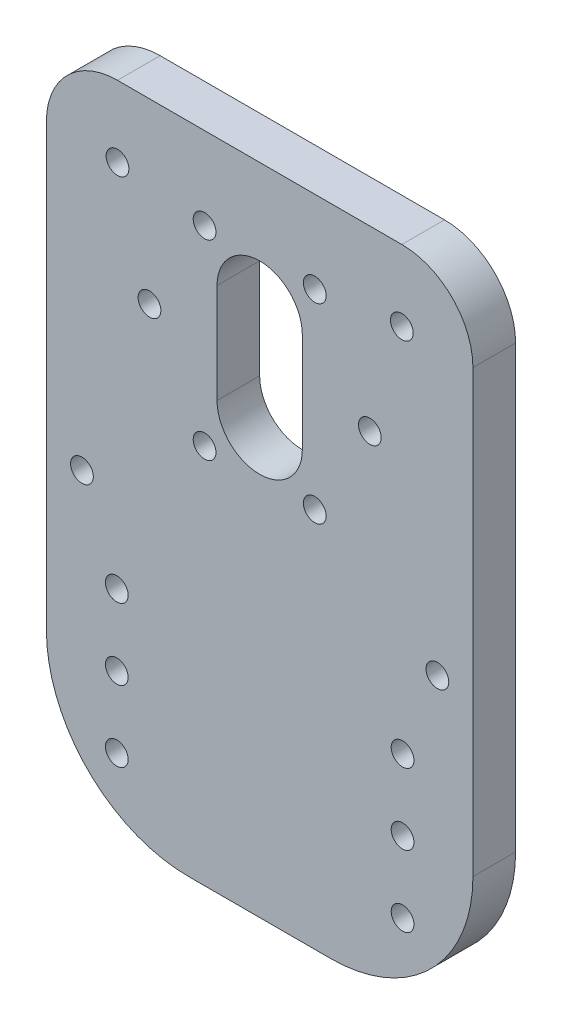
ISO-10303-21;
HEADER;
FILE_DESCRIPTION(('STEP AP214'),'2;1');
FILE_NAME('part.step','',(''),(''),'','','');
FILE_SCHEMA(('AUTOMOTIVE_DESIGN { 1 0 10303 214 1 1 1 1 }'));
ENDSEC;
DATA;
#1=APPLICATION_CONTEXT('core data for automotive mechanical design processes');
#2=APPLICATION_PROTOCOL_DEFINITION('international standard','automotive_design',2000,#1);
#3=PRODUCT_CONTEXT('',#1,'mechanical');
#4=PRODUCT('Part','Part','',(#3));
#5=PRODUCT_RELATED_PRODUCT_CATEGORY('part','',(#4));
#6=PRODUCT_DEFINITION_FORMATION('','',#4);
#7=PRODUCT_DEFINITION_CONTEXT('part definition',#1,'design');
#8=PRODUCT_DEFINITION('design','',#6,#7);
#9=PRODUCT_DEFINITION_SHAPE('','',#8);
#10=(LENGTH_UNIT() NAMED_UNIT(*) SI_UNIT(.MILLI.,.METRE.));
#11=(NAMED_UNIT(*) PLANE_ANGLE_UNIT() SI_UNIT($,.RADIAN.));
#12=(NAMED_UNIT(*) SI_UNIT($,.STERADIAN.) SOLID_ANGLE_UNIT());
#13=UNCERTAINTY_MEASURE_WITH_UNIT(LENGTH_MEASURE(1.E-05),#10,'distance_accuracy_value','');
#14=(GEOMETRIC_REPRESENTATION_CONTEXT(3) GLOBAL_UNCERTAINTY_ASSIGNED_CONTEXT((#13)) GLOBAL_UNIT_ASSIGNED_CONTEXT((#10,
#11,#12)) REPRESENTATION_CONTEXT('',''));
#15=CARTESIAN_POINT('',(0.,0.,0.));
#16=DIRECTION('',(0.,0.,1.));
#17=DIRECTION('',(1.,0.,0.));
#18=AXIS2_PLACEMENT_3D('',#15,#16,#17);
#19=CARTESIAN_POINT('',(0.,0.,6.));
#20=DIRECTION('',(0.,0.,1.));
#21=DIRECTION('',(1.,0.,0.));
#22=AXIS2_PLACEMENT_3D('',#19,#20,#21);
#23=PLANE('',#22);
#24=CARTESIAN_POINT('',(-15.5,35.,6.));
#25=DIRECTION('',(0.,0.,1.));
#26=DIRECTION('',(1.,0.,0.));
#27=AXIS2_PLACEMENT_3D('',#24,#25,#26);
#28=CIRCLE('',#27,1.6);
#29=CARTESIAN_POINT('',(-13.9,35.,6.));
#30=VERTEX_POINT('',#29);
#31=EDGE_CURVE('E267',#30,#30,#28,.T.);
#32=ORIENTED_EDGE('',*,*,#31,.F.);
#33=EDGE_LOOP('',(#32));
#34=FACE_BOUND('',#33,.T.);
#35=CARTESIAN_POINT('',(-7.75000000000016,21.5766062413413,6.));
#36=DIRECTION('',(0.,0.,1.));
#37=DIRECTION('',(1.,0.,0.));
#38=AXIS2_PLACEMENT_3D('',#35,#36,#37);
#39=CIRCLE('',#38,1.6);
#40=CARTESIAN_POINT('',(-6.15000000000016,21.5766062413413,6.));
#41=VERTEX_POINT('',#40);
#42=EDGE_CURVE('E756',#41,#41,#39,.T.);
#43=ORIENTED_EDGE('',*,*,#42,.F.);
#44=EDGE_LOOP('',(#43));
#45=FACE_BOUND('',#44,.T.);
#46=CARTESIAN_POINT('',(7.74999999999988,21.5766062413412,6.));
#47=DIRECTION('',(0.,0.,1.));
#48=DIRECTION('',(1.,0.,0.));
#49=AXIS2_PLACEMENT_3D('',#46,#47,#48);
#50=CIRCLE('',#49,1.6);
#51=CARTESIAN_POINT('',(9.34999999999988,21.5766062413412,6.));
#52=VERTEX_POINT('',#51);
#53=EDGE_CURVE('E759',#52,#52,#50,.T.);
#54=ORIENTED_EDGE('',*,*,#53,.F.);
#55=EDGE_LOOP('',(#54));
#56=FACE_BOUND('',#55,.T.);
#57=CARTESIAN_POINT('',(15.5,34.9999999999999,6.));
#58=DIRECTION('',(0.,0.,1.));
#59=DIRECTION('',(1.,0.,0.));
#60=AXIS2_PLACEMENT_3D('',#57,#58,#59);
#61=CIRCLE('',#60,1.6);
#62=CARTESIAN_POINT('',(17.1,34.9999999999999,6.));
#63=VERTEX_POINT('',#62);
#64=EDGE_CURVE('E764',#63,#63,#61,.T.);
#65=ORIENTED_EDGE('',*,*,#64,.F.);
#66=EDGE_LOOP('',(#65));
#67=FACE_BOUND('',#66,.T.);
#68=CARTESIAN_POINT('',(7.75000000000007,48.4233937586588,6.));
#69=DIRECTION('',(0.,0.,1.));
#70=DIRECTION('',(1.,0.,0.));
#71=AXIS2_PLACEMENT_3D('',#68,#69,#70);
#72=CIRCLE('',#71,1.6);
#73=CARTESIAN_POINT('',(9.35000000000007,48.4233937586588,6.));
#74=VERTEX_POINT('',#73);
#75=EDGE_CURVE('E753',#74,#74,#72,.T.);
#76=ORIENTED_EDGE('',*,*,#75,.F.);
#77=EDGE_LOOP('',(#76));
#78=FACE_BOUND('',#77,.T.);
#79=CARTESIAN_POINT('',(-7.74999999999998,48.4233937586589,6.));
#80=DIRECTION('',(0.,0.,1.));
#81=DIRECTION('',(1.,0.,0.));
#82=AXIS2_PLACEMENT_3D('',#79,#80,#81);
#83=CIRCLE('',#82,1.6);
#84=CARTESIAN_POINT('',(-6.14999999999998,48.4233937586589,6.));
#85=VERTEX_POINT('',#84);
#86=EDGE_CURVE('E749',#85,#85,#83,.T.);
#87=ORIENTED_EDGE('',*,*,#86,.F.);
#88=EDGE_LOOP('',(#87));
#89=FACE_BOUND('',#88,.T.);
#90=CARTESIAN_POINT('',(24.9999999999999,9.99999999999976,6.));
#91=DIRECTION('',(0.,0.,1.));
#92=DIRECTION('',(1.,0.,0.));
#93=AXIS2_PLACEMENT_3D('',#90,#91,#92);
#94=CIRCLE('',#93,1.6);
#95=CARTESIAN_POINT('',(26.5999999999999,9.99999999999976,6.));
#96=VERTEX_POINT('',#95);
#97=EDGE_CURVE('E316',#96,#96,#94,.T.);
#98=ORIENTED_EDGE('',*,*,#97,.F.);
#99=EDGE_LOOP('',(#98));
#100=FACE_BOUND('',#99,.T.);
#101=CARTESIAN_POINT('',(-25.0000000000001,10.0000000000001,6.));
#102=DIRECTION('',(0.,0.,1.));
#103=DIRECTION('',(1.,0.,0.));
#104=AXIS2_PLACEMENT_3D('',#101,#102,#103);
#105=CIRCLE('',#104,1.6);
#106=CARTESIAN_POINT('',(-23.4000000000001,10.0000000000001,6.));
#107=VERTEX_POINT('',#106);
#108=EDGE_CURVE('E312',#107,#107,#105,.T.);
#109=ORIENTED_EDGE('',*,*,#108,.F.);
#110=EDGE_LOOP('',(#109));
#111=FACE_BOUND('',#110,.T.);
#112=CARTESIAN_POINT('',(-20.,50.0000000000003,6.));
#113=DIRECTION('',(0.,0.,1.));
#114=DIRECTION('',(1.,0.,0.));
#115=AXIS2_PLACEMENT_3D('',#112,#113,#114);
#116=CIRCLE('',#115,1.6);
#117=CARTESIAN_POINT('',(-18.4,50.0000000000003,6.));
#118=VERTEX_POINT('',#117);
#119=EDGE_CURVE('E308',#118,#118,#116,.T.);
#120=ORIENTED_EDGE('',*,*,#119,.F.);
#121=EDGE_LOOP('',(#120));
#122=FACE_BOUND('',#121,.T.);
#123=CARTESIAN_POINT('',(20.,50.,6.));
#124=DIRECTION('',(0.,0.,1.));
#125=DIRECTION('',(1.,0.,0.));
#126=AXIS2_PLACEMENT_3D('',#123,#124,#125);
#127=CIRCLE('',#126,1.6);
#128=CARTESIAN_POINT('',(21.6,50.,6.));
#129=VERTEX_POINT('',#128);
#130=EDGE_CURVE('E304',#129,#129,#127,.T.);
#131=ORIENTED_EDGE('',*,*,#130,.F.);
#132=EDGE_LOOP('',(#131));
#133=FACE_BOUND('',#132,.T.);
#134=CARTESIAN_POINT('',(-20.0999999999999,-22.,6.));
#135=DIRECTION('',(0.,0.,1.));
#136=DIRECTION('',(1.,0.,0.));
#137=AXIS2_PLACEMENT_3D('',#134,#135,#136);
#138=CIRCLE('',#137,1.6);
#139=CARTESIAN_POINT('',(-18.4999999999999,-22.,6.));
#140=VERTEX_POINT('',#139);
#141=EDGE_CURVE('E362',#140,#140,#138,.T.);
#142=ORIENTED_EDGE('',*,*,#141,.F.);
#143=EDGE_LOOP('',(#142));
#144=FACE_BOUND('',#143,.T.);
#145=CARTESIAN_POINT('',(-20.1,-12.,6.));
#146=DIRECTION('',(0.,0.,1.));
#147=DIRECTION('',(1.,0.,0.));
#148=AXIS2_PLACEMENT_3D('',#145,#146,#147);
#149=CIRCLE('',#148,1.6);
#150=CARTESIAN_POINT('',(-18.5,-12.,6.));
#151=VERTEX_POINT('',#150);
#152=EDGE_CURVE('E354',#151,#151,#149,.T.);
#153=ORIENTED_EDGE('',*,*,#152,.F.);
#154=EDGE_LOOP('',(#153));
#155=FACE_BOUND('',#154,.T.);
#156=CARTESIAN_POINT('',(-20.1,-1.99999999999997,6.));
#157=DIRECTION('',(0.,0.,1.));
#158=DIRECTION('',(1.,0.,0.));
#159=AXIS2_PLACEMENT_3D('',#156,#157,#158);
#160=CIRCLE('',#159,1.6);
#161=CARTESIAN_POINT('',(-18.5,-1.99999999999997,6.));
#162=VERTEX_POINT('',#161);
#163=EDGE_CURVE('E346',#162,#162,#160,.T.);
#164=ORIENTED_EDGE('',*,*,#163,.F.);
#165=EDGE_LOOP('',(#164));
#166=FACE_BOUND('',#165,.T.);
#167=DIRECTION('',(0.,-1.,0.));
#168=VECTOR('',#167,1.);
#169=CARTESIAN_POINT('',(-5.99999999999999,0.,6.));
#170=LINE('',#169,#168);
#171=CARTESIAN_POINT('',(-6.,42.,6.));
#172=VERTEX_POINT('',#171);
#173=CARTESIAN_POINT('',(-6.,28.,6.));
#174=VERTEX_POINT('',#173);
#175=EDGE_CURVE('E142',#172,#174,#170,.T.);
#176=ORIENTED_EDGE('',*,*,#175,.F.);
#177=CARTESIAN_POINT('',(0.,42.,6.));
#178=DIRECTION('',(0.,0.,1.));
#179=DIRECTION('',(1.,0.,0.));
#180=AXIS2_PLACEMENT_3D('',#177,#178,#179);
#181=CIRCLE('',#180,6.);
#182=CARTESIAN_POINT('',(6.00000000000001,42.,6.));
#183=VERTEX_POINT('',#182);
#184=EDGE_CURVE('E157',#183,#172,#181,.T.);
#185=ORIENTED_EDGE('',*,*,#184,.F.);
#186=DIRECTION('',(0.,-1.,0.));
#187=VECTOR('',#186,1.);
#188=CARTESIAN_POINT('',(6.00000000000001,0.,6.));
#189=LINE('',#188,#187);
#190=CARTESIAN_POINT('',(6.00000000000001,28.,6.));
#191=VERTEX_POINT('',#190);
#192=EDGE_CURVE('E166',#183,#191,#189,.T.);
#193=ORIENTED_EDGE('',*,*,#192,.T.);
#194=CARTESIAN_POINT('',(0.,28.,6.));
#195=DIRECTION('',(0.,0.,1.));
#196=DIRECTION('',(1.,0.,0.));
#197=AXIS2_PLACEMENT_3D('',#194,#195,#196);
#198=CIRCLE('',#197,6.);
#199=EDGE_CURVE('E159',#174,#191,#198,.T.);
#200=ORIENTED_EDGE('',*,*,#199,.F.);
#201=EDGE_LOOP('',(#176,#185,#193,#200));
#202=FACE_BOUND('',#201,.T.);
#203=CARTESIAN_POINT('',(20.1000000000004,-21.9999999999998,6.));
#204=DIRECTION('',(0.,0.,1.));
#205=DIRECTION('',(1.,0.,0.));
#206=AXIS2_PLACEMENT_3D('',#203,#204,#205);
#207=CIRCLE('',#206,1.6);
#208=CARTESIAN_POINT('',(21.7000000000004,-21.9999999999998,6.));
#209=VERTEX_POINT('',#208);
#210=EDGE_CURVE('E333',#209,#209,#207,.F.);
#211=ORIENTED_EDGE('',*,*,#210,.T.);
#212=EDGE_LOOP('',(#211));
#213=FACE_BOUND('',#212,.T.);
#214=CARTESIAN_POINT('',(20.1000000000002,-1.99999999999975,6.));
#215=DIRECTION('',(0.,0.,1.));
#216=DIRECTION('',(1.,0.,0.));
#217=AXIS2_PLACEMENT_3D('',#214,#215,#216);
#218=CIRCLE('',#217,1.6);
#219=CARTESIAN_POINT('',(21.7000000000002,-1.99999999999975,6.));
#220=VERTEX_POINT('',#219);
#221=EDGE_CURVE('E329',#220,#220,#218,.F.);
#222=ORIENTED_EDGE('',*,*,#221,.T.);
#223=EDGE_LOOP('',(#222));
#224=FACE_BOUND('',#223,.T.);
#225=CARTESIAN_POINT('',(20.1000000000003,-11.9999999999998,6.));
#226=DIRECTION('',(0.,0.,1.));
#227=DIRECTION('',(1.,0.,0.));
#228=AXIS2_PLACEMENT_3D('',#225,#226,#227);
#229=CIRCLE('',#228,1.6);
#230=CARTESIAN_POINT('',(21.7000000000003,-11.9999999999998,6.));
#231=VERTEX_POINT('',#230);
#232=EDGE_CURVE('E338',#231,#231,#229,.F.);
#233=ORIENTED_EDGE('',*,*,#232,.T.);
#234=EDGE_LOOP('',(#233));
#235=FACE_BOUND('',#234,.T.);
#236=DIRECTION('',(1.,0.,0.));
#237=VECTOR('',#236,1.);
#238=CARTESIAN_POINT('',(0.,-32.,6.));
#239=LINE('',#238,#237);
#240=CARTESIAN_POINT('',(-9.99999999999997,-32.,6.));
#241=VERTEX_POINT('',#240);
#242=CARTESIAN_POINT('',(10.,-32.,6.));
#243=VERTEX_POINT('',#242);
#244=EDGE_CURVE('E320',#241,#243,#239,.T.);
#245=ORIENTED_EDGE('',*,*,#244,.T.);
#246=CARTESIAN_POINT('',(10.,-12.,6.));
#247=DIRECTION('',(0.,0.,1.));
#248=DIRECTION('',(1.,0.,0.));
#249=AXIS2_PLACEMENT_3D('',#246,#247,#248);
#250=CIRCLE('',#249,20.);
#251=CARTESIAN_POINT('',(30.,-12.,6.));
#252=VERTEX_POINT('',#251);
#253=EDGE_CURVE('E253',#243,#252,#250,.T.);
#254=ORIENTED_EDGE('',*,*,#253,.T.);
#255=DIRECTION('',(0.,1.,0.));
#256=VECTOR('',#255,1.);
#257=CARTESIAN_POINT('',(30.,0.,6.));
#258=LINE('',#257,#256);
#259=CARTESIAN_POINT('',(30.,50.,6.));
#260=VERTEX_POINT('',#259);
#261=EDGE_CURVE('E174',#252,#260,#258,.T.);
#262=ORIENTED_EDGE('',*,*,#261,.T.);
#263=CARTESIAN_POINT('',(20.,50.,6.));
#264=DIRECTION('',(0.,0.,1.));
#265=DIRECTION('',(1.,0.,0.));
#266=AXIS2_PLACEMENT_3D('',#263,#264,#265);
#267=CIRCLE('',#266,10.);
#268=CARTESIAN_POINT('',(20.,60.,6.));
#269=VERTEX_POINT('',#268);
#270=EDGE_CURVE('E229',#260,#269,#267,.T.);
#271=ORIENTED_EDGE('',*,*,#270,.T.);
#272=DIRECTION('',(1.,0.,0.));
#273=VECTOR('',#272,1.);
#274=CARTESIAN_POINT('',(0.,60.,6.));
#275=LINE('',#274,#273);
#276=CARTESIAN_POINT('',(-20.,60.,6.));
#277=VERTEX_POINT('',#276);
#278=EDGE_CURVE('E177',#277,#269,#275,.T.);
#279=ORIENTED_EDGE('',*,*,#278,.F.);
#280=CARTESIAN_POINT('',(-20.,50.,6.));
#281=DIRECTION('',(0.,0.,1.));
#282=DIRECTION('',(1.,0.,0.));
#283=AXIS2_PLACEMENT_3D('',#280,#281,#282);
#284=CIRCLE('',#283,10.);
#285=CARTESIAN_POINT('',(-30.,50.,6.));
#286=VERTEX_POINT('',#285);
#287=EDGE_CURVE('E225',#277,#286,#284,.T.);
#288=ORIENTED_EDGE('',*,*,#287,.T.);
#289=DIRECTION('',(0.,1.,0.));
#290=VECTOR('',#289,1.);
#291=CARTESIAN_POINT('',(-30.,0.,6.));
#292=LINE('',#291,#290);
#293=CARTESIAN_POINT('',(-30.,-12.,6.));
#294=VERTEX_POINT('',#293);
#295=EDGE_CURVE('E181',#294,#286,#292,.T.);
#296=ORIENTED_EDGE('',*,*,#295,.F.);
#297=CARTESIAN_POINT('',(-9.99999999999997,-12.,6.));
#298=DIRECTION('',(0.,0.,1.));
#299=DIRECTION('',(1.,0.,0.));
#300=AXIS2_PLACEMENT_3D('',#297,#298,#299);
#301=CIRCLE('',#300,20.);
#302=EDGE_CURVE('E250',#294,#241,#301,.T.);
#303=ORIENTED_EDGE('',*,*,#302,.T.);
#304=EDGE_LOOP('',(#245,#254,#262,#271,#279,#288,#296,#303));
#305=FACE_BOUND('',#304,.T.);
#306=ADVANCED_FACE('F45',(#34,#45,#56,#67,#78,#89,#100,#111,#122,#133,#144,#155,#166,#202,#213,
#224,#235,#305),#23,.T.);
#307=CARTESIAN_POINT('',(0.,0.,0.));
#308=DIRECTION('',(0.,0.,1.));
#309=DIRECTION('',(1.,0.,0.));
#310=AXIS2_PLACEMENT_3D('',#307,#308,#309);
#311=PLANE('',#310);
#312=CARTESIAN_POINT('',(-15.5,35.,0.));
#313=DIRECTION('',(0.,0.,1.));
#314=DIRECTION('',(1.,0.,0.));
#315=AXIS2_PLACEMENT_3D('',#312,#313,#314);
#316=CIRCLE('',#315,1.6);
#317=CARTESIAN_POINT('',(-13.9,35.,0.));
#318=VERTEX_POINT('',#317);
#319=EDGE_CURVE('E49',#318,#318,#316,.T.);
#320=ORIENTED_EDGE('',*,*,#319,.T.);
#321=EDGE_LOOP('',(#320));
#322=FACE_BOUND('',#321,.T.);
#323=CARTESIAN_POINT('',(-7.75000000000016,21.5766062413413,0.));
#324=DIRECTION('',(0.,0.,1.));
#325=DIRECTION('',(1.,0.,0.));
#326=AXIS2_PLACEMENT_3D('',#323,#324,#325);
#327=CIRCLE('',#326,1.6);
#328=CARTESIAN_POINT('',(-6.15000000000016,21.5766062413413,0.));
#329=VERTEX_POINT('',#328);
#330=EDGE_CURVE('E278',#329,#329,#327,.T.);
#331=ORIENTED_EDGE('',*,*,#330,.T.);
#332=EDGE_LOOP('',(#331));
#333=FACE_BOUND('',#332,.T.);
#334=CARTESIAN_POINT('',(7.74999999999988,21.5766062413412,0.));
#335=DIRECTION('',(0.,0.,1.));
#336=DIRECTION('',(1.,0.,0.));
#337=AXIS2_PLACEMENT_3D('',#334,#335,#336);
#338=CIRCLE('',#337,1.6);
#339=CARTESIAN_POINT('',(9.34999999999988,21.5766062413412,0.));
#340=VERTEX_POINT('',#339);
#341=EDGE_CURVE('E275',#340,#340,#338,.T.);
#342=ORIENTED_EDGE('',*,*,#341,.T.);
#343=EDGE_LOOP('',(#342));
#344=FACE_BOUND('',#343,.T.);
#345=CARTESIAN_POINT('',(15.5,34.9999999999999,0.));
#346=DIRECTION('',(0.,0.,1.));
#347=DIRECTION('',(1.,0.,0.));
#348=AXIS2_PLACEMENT_3D('',#345,#346,#347);
#349=CIRCLE('',#348,1.6);
#350=CARTESIAN_POINT('',(17.1,34.9999999999999,0.));
#351=VERTEX_POINT('',#350);
#352=EDGE_CURVE('E271',#351,#351,#349,.T.);
#353=ORIENTED_EDGE('',*,*,#352,.T.);
#354=EDGE_LOOP('',(#353));
#355=FACE_BOUND('',#354,.T.);
#356=CARTESIAN_POINT('',(7.75000000000007,48.4233937586588,0.));
#357=DIRECTION('',(0.,0.,1.));
#358=DIRECTION('',(1.,0.,0.));
#359=AXIS2_PLACEMENT_3D('',#356,#357,#358);
#360=CIRCLE('',#359,1.6);
#361=CARTESIAN_POINT('',(9.35000000000007,48.4233937586588,0.));
#362=VERTEX_POINT('',#361);
#363=EDGE_CURVE('E266',#362,#362,#360,.T.);
#364=ORIENTED_EDGE('',*,*,#363,.T.);
#365=EDGE_LOOP('',(#364));
#366=FACE_BOUND('',#365,.T.);
#367=CARTESIAN_POINT('',(-7.74999999999998,48.4233937586589,0.));
#368=DIRECTION('',(0.,0.,1.));
#369=DIRECTION('',(1.,0.,0.));
#370=AXIS2_PLACEMENT_3D('',#367,#368,#369);
#371=CIRCLE('',#370,1.6);
#372=CARTESIAN_POINT('',(-6.14999999999998,48.4233937586589,0.));
#373=VERTEX_POINT('',#372);
#374=EDGE_CURVE('E262',#373,#373,#371,.T.);
#375=ORIENTED_EDGE('',*,*,#374,.T.);
#376=EDGE_LOOP('',(#375));
#377=FACE_BOUND('',#376,.T.);
#378=CARTESIAN_POINT('',(24.9999999999999,9.99999999999976,0.));
#379=DIRECTION('',(0.,0.,-1.));
#380=DIRECTION('',(-1.,0.,0.));
#381=AXIS2_PLACEMENT_3D('',#378,#379,#380);
#382=CIRCLE('',#381,1.6);
#383=CARTESIAN_POINT('',(23.3999999999999,9.99999999999976,0.));
#384=VERTEX_POINT('',#383);
#385=EDGE_CURVE('E285',#384,#384,#382,.T.);
#386=ORIENTED_EDGE('',*,*,#385,.F.);
#387=EDGE_LOOP('',(#386));
#388=FACE_BOUND('',#387,.T.);
#389=CARTESIAN_POINT('',(-25.0000000000001,10.0000000000001,0.));
#390=DIRECTION('',(0.,0.,-1.));
#391=DIRECTION('',(-1.,0.,0.));
#392=AXIS2_PLACEMENT_3D('',#389,#390,#391);
#393=CIRCLE('',#392,1.6);
#394=CARTESIAN_POINT('',(-26.6000000000001,10.0000000000001,0.));
#395=VERTEX_POINT('',#394);
#396=EDGE_CURVE('E290',#395,#395,#393,.T.);
#397=ORIENTED_EDGE('',*,*,#396,.F.);
#398=EDGE_LOOP('',(#397));
#399=FACE_BOUND('',#398,.T.);
#400=CARTESIAN_POINT('',(-20.,50.0000000000003,0.));
#401=DIRECTION('',(0.,0.,-1.));
#402=DIRECTION('',(-1.,0.,0.));
#403=AXIS2_PLACEMENT_3D('',#400,#401,#402);
#404=CIRCLE('',#403,1.6);
#405=CARTESIAN_POINT('',(-21.6000000000001,50.0000000000003,0.));
#406=VERTEX_POINT('',#405);
#407=EDGE_CURVE('E296',#406,#406,#404,.T.);
#408=ORIENTED_EDGE('',*,*,#407,.F.);
#409=EDGE_LOOP('',(#408));
#410=FACE_BOUND('',#409,.T.);
#411=CARTESIAN_POINT('',(20.,50.,0.));
#412=DIRECTION('',(0.,0.,-1.));
#413=DIRECTION('',(-1.,0.,0.));
#414=AXIS2_PLACEMENT_3D('',#411,#412,#413);
#415=CIRCLE('',#414,1.6);
#416=CARTESIAN_POINT('',(18.4,50.,0.));
#417=VERTEX_POINT('',#416);
#418=EDGE_CURVE('E300',#417,#417,#415,.T.);
#419=ORIENTED_EDGE('',*,*,#418,.F.);
#420=EDGE_LOOP('',(#419));
#421=FACE_BOUND('',#420,.T.);
#422=CARTESIAN_POINT('',(-20.0999999999999,-22.,0.));
#423=DIRECTION('',(0.,0.,1.));
#424=DIRECTION('',(1.,0.,0.));
#425=AXIS2_PLACEMENT_3D('',#422,#423,#424);
#426=CIRCLE('',#425,1.6);
#427=CARTESIAN_POINT('',(-18.4999999999999,-22.,0.));
#428=VERTEX_POINT('',#427);
#429=EDGE_CURVE('E325',#428,#428,#426,.T.);
#430=ORIENTED_EDGE('',*,*,#429,.T.);
#431=EDGE_LOOP('',(#430));
#432=FACE_BOUND('',#431,.T.);
#433=CARTESIAN_POINT('',(-20.1,-1.99999999999997,0.));
#434=DIRECTION('',(0.,0.,1.));
#435=DIRECTION('',(1.,0.,0.));
#436=AXIS2_PLACEMENT_3D('',#433,#434,#435);
#437=CIRCLE('',#436,1.6);
#438=CARTESIAN_POINT('',(-18.5,-1.99999999999997,0.));
#439=VERTEX_POINT('',#438);
#440=EDGE_CURVE('E350',#439,#439,#437,.T.);
#441=ORIENTED_EDGE('',*,*,#440,.T.);
#442=EDGE_LOOP('',(#441));
#443=FACE_BOUND('',#442,.T.);
#444=CARTESIAN_POINT('',(20.1000000000003,-11.9999999999998,0.));
#445=DIRECTION('',(0.,0.,1.));
#446=DIRECTION('',(1.,0.,0.));
#447=AXIS2_PLACEMENT_3D('',#444,#445,#446);
#448=CIRCLE('',#447,1.6);
#449=CARTESIAN_POINT('',(21.7000000000003,-11.9999999999998,0.));
#450=VERTEX_POINT('',#449);
#451=EDGE_CURVE('E342',#450,#450,#448,.F.);
#452=ORIENTED_EDGE('',*,*,#451,.F.);
#453=EDGE_LOOP('',(#452));
#454=FACE_BOUND('',#453,.T.);
#455=CARTESIAN_POINT('',(20.1000000000002,-1.99999999999975,0.));
#456=DIRECTION('',(0.,0.,1.));
#457=DIRECTION('',(1.,0.,0.));
#458=AXIS2_PLACEMENT_3D('',#455,#456,#457);
#459=CIRCLE('',#458,1.6);
#460=CARTESIAN_POINT('',(21.7000000000002,-1.99999999999975,0.));
#461=VERTEX_POINT('',#460);
#462=EDGE_CURVE('E334',#461,#461,#459,.F.);
#463=ORIENTED_EDGE('',*,*,#462,.F.);
#464=EDGE_LOOP('',(#463));
#465=FACE_BOUND('',#464,.T.);
#466=CARTESIAN_POINT('',(20.1000000000004,-21.9999999999998,0.));
#467=DIRECTION('',(0.,0.,1.));
#468=DIRECTION('',(1.,0.,0.));
#469=AXIS2_PLACEMENT_3D('',#466,#467,#468);
#470=CIRCLE('',#469,1.6);
#471=CARTESIAN_POINT('',(21.7000000000004,-21.9999999999998,0.));
#472=VERTEX_POINT('',#471);
#473=EDGE_CURVE('E188',#472,#472,#470,.F.);
#474=ORIENTED_EDGE('',*,*,#473,.F.);
#475=EDGE_LOOP('',(#474));
#476=FACE_BOUND('',#475,.T.);
#477=DIRECTION('',(0.,-1.,0.));
#478=VECTOR('',#477,1.);
#479=CARTESIAN_POINT('',(-5.99999999999999,0.,0.));
#480=LINE('',#479,#478);
#481=CARTESIAN_POINT('',(-6.,42.,0.));
#482=VERTEX_POINT('',#481);
#483=CARTESIAN_POINT('',(-6.,28.,0.));
#484=VERTEX_POINT('',#483);
#485=EDGE_CURVE('E145',#482,#484,#480,.T.);
#486=ORIENTED_EDGE('',*,*,#485,.T.);
#487=CARTESIAN_POINT('',(0.,28.,0.));
#488=DIRECTION('',(0.,0.,1.));
#489=DIRECTION('',(1.,0.,0.));
#490=AXIS2_PLACEMENT_3D('',#487,#488,#489);
#491=CIRCLE('',#490,6.);
#492=CARTESIAN_POINT('',(6.00000000000001,28.,0.));
#493=VERTEX_POINT('',#492);
#494=EDGE_CURVE('E195',#484,#493,#491,.T.);
#495=ORIENTED_EDGE('',*,*,#494,.T.);
#496=DIRECTION('',(0.,-1.,0.));
#497=VECTOR('',#496,1.);
#498=CARTESIAN_POINT('',(6.00000000000001,0.,0.));
#499=LINE('',#498,#497);
#500=CARTESIAN_POINT('',(6.00000000000001,42.,0.));
#501=VERTEX_POINT('',#500);
#502=EDGE_CURVE('E191',#501,#493,#499,.T.);
#503=ORIENTED_EDGE('',*,*,#502,.F.);
#504=CARTESIAN_POINT('',(0.,42.,0.));
#505=DIRECTION('',(0.,0.,1.));
#506=DIRECTION('',(1.,0.,0.));
#507=AXIS2_PLACEMENT_3D('',#504,#505,#506);
#508=CIRCLE('',#507,6.);
#509=EDGE_CURVE('E187',#501,#482,#508,.T.);
#510=ORIENTED_EDGE('',*,*,#509,.T.);
#511=EDGE_LOOP('',(#486,#495,#503,#510));
#512=FACE_BOUND('',#511,.T.);
#513=CARTESIAN_POINT('',(-20.1,-12.,0.));
#514=DIRECTION('',(0.,0.,1.));
#515=DIRECTION('',(1.,0.,0.));
#516=AXIS2_PLACEMENT_3D('',#513,#514,#515);
#517=CIRCLE('',#516,1.6);
#518=CARTESIAN_POINT('',(-18.5,-12.,0.));
#519=VERTEX_POINT('',#518);
#520=EDGE_CURVE('E358',#519,#519,#517,.T.);
#521=ORIENTED_EDGE('',*,*,#520,.T.);
#522=EDGE_LOOP('',(#521));
#523=FACE_BOUND('',#522,.T.);
#524=DIRECTION('',(0.,1.,0.));
#525=VECTOR('',#524,1.);
#526=CARTESIAN_POINT('',(30.,0.,0.));
#527=LINE('',#526,#525);
#528=CARTESIAN_POINT('',(30.,-12.,0.));
#529=VERTEX_POINT('',#528);
#530=CARTESIAN_POINT('',(30.,50.,0.));
#531=VERTEX_POINT('',#530);
#532=EDGE_CURVE('E199',#529,#531,#527,.T.);
#533=ORIENTED_EDGE('',*,*,#532,.F.);
#534=CARTESIAN_POINT('',(10.,-12.,0.));
#535=DIRECTION('',(0.,0.,1.));
#536=DIRECTION('',(1.,0.,0.));
#537=AXIS2_PLACEMENT_3D('',#534,#535,#536);
#538=CIRCLE('',#537,20.);
#539=CARTESIAN_POINT('',(10.,-32.,0.));
#540=VERTEX_POINT('',#539);
#541=EDGE_CURVE('E55',#529,#540,#538,.F.);
#542=ORIENTED_EDGE('',*,*,#541,.T.);
#543=DIRECTION('',(1.,0.,0.));
#544=VECTOR('',#543,1.);
#545=CARTESIAN_POINT('',(0.,-32.,0.));
#546=LINE('',#545,#544);
#547=CARTESIAN_POINT('',(-9.99999999999997,-32.,0.));
#548=VERTEX_POINT('',#547);
#549=EDGE_CURVE('E321',#548,#540,#546,.T.);
#550=ORIENTED_EDGE('',*,*,#549,.F.);
#551=CARTESIAN_POINT('',(-9.99999999999997,-12.,0.));
#552=DIRECTION('',(0.,0.,1.));
#553=DIRECTION('',(1.,0.,0.));
#554=AXIS2_PLACEMENT_3D('',#551,#552,#553);
#555=CIRCLE('',#554,20.);
#556=CARTESIAN_POINT('',(-30.,-12.,0.));
#557=VERTEX_POINT('',#556);
#558=EDGE_CURVE('E63',#548,#557,#555,.F.);
#559=ORIENTED_EDGE('',*,*,#558,.T.);
#560=DIRECTION('',(0.,1.,0.));
#561=VECTOR('',#560,1.);
#562=CARTESIAN_POINT('',(-30.,0.,0.));
#563=LINE('',#562,#561);
#564=CARTESIAN_POINT('',(-30.,50.,0.));
#565=VERTEX_POINT('',#564);
#566=EDGE_CURVE('E161',#557,#565,#563,.T.);
#567=ORIENTED_EDGE('',*,*,#566,.T.);
#568=CARTESIAN_POINT('',(-20.,50.,0.));
#569=DIRECTION('',(0.,0.,1.));
#570=DIRECTION('',(1.,0.,0.));
#571=AXIS2_PLACEMENT_3D('',#568,#569,#570);
#572=CIRCLE('',#571,10.);
#573=CARTESIAN_POINT('',(-20.,60.,0.));
#574=VERTEX_POINT('',#573);
#575=EDGE_CURVE('E218',#565,#574,#572,.F.);
#576=ORIENTED_EDGE('',*,*,#575,.T.);
#577=DIRECTION('',(1.,0.,0.));
#578=VECTOR('',#577,1.);
#579=CARTESIAN_POINT('',(0.,60.,0.));
#580=LINE('',#579,#578);
#581=CARTESIAN_POINT('',(20.,60.,0.));
#582=VERTEX_POINT('',#581);
#583=EDGE_CURVE('E202',#574,#582,#580,.T.);
#584=ORIENTED_EDGE('',*,*,#583,.T.);
#585=CARTESIAN_POINT('',(20.,50.,0.));
#586=DIRECTION('',(0.,0.,1.));
#587=DIRECTION('',(1.,0.,0.));
#588=AXIS2_PLACEMENT_3D('',#585,#586,#587);
#589=CIRCLE('',#588,10.);
#590=EDGE_CURVE('E221',#582,#531,#589,.F.);
#591=ORIENTED_EDGE('',*,*,#590,.T.);
#592=EDGE_LOOP('',(#533,#542,#550,#559,#567,#576,#584,#591));
#593=FACE_BOUND('',#592,.T.);
#594=ADVANCED_FACE('F395',(#322,#333,#344,#355,#366,#377,#388,#399,#410,#421,#432,#443,#454,
#465,#476,#512,#523,#593),#311,.F.);
#595=CARTESIAN_POINT('',(30.,0.,6.));
#596=DIRECTION('',(-1.,0.,0.));
#597=DIRECTION('',(0.,-1.,0.));
#598=AXIS2_PLACEMENT_3D('',#595,#596,#597);
#599=PLANE('',#598);
#600=ORIENTED_EDGE('',*,*,#261,.F.);
#601=DIRECTION('',(0.,0.,1.));
#602=VECTOR('',#601,1.);
#603=CARTESIAN_POINT('',(30.,-12.,0.));
#604=LINE('',#603,#602);
#605=EDGE_CURVE('E71',#252,#529,#604,.F.);
#606=ORIENTED_EDGE('',*,*,#605,.T.);
#607=ORIENTED_EDGE('',*,*,#532,.T.);
#608=DIRECTION('',(0.,0.,-1.));
#609=VECTOR('',#608,1.);
#610=CARTESIAN_POINT('',(30.,50.,6.));
#611=LINE('',#610,#609);
#612=EDGE_CURVE('E151',#531,#260,#611,.F.);
#613=ORIENTED_EDGE('',*,*,#612,.T.);
#614=EDGE_LOOP('',(#600,#606,#607,#613));
#615=FACE_BOUND('',#614,.T.);
#616=ADVANCED_FACE('F401',(#615),#599,.F.);
#617=CARTESIAN_POINT('',(-30.,0.,6.));
#618=DIRECTION('',(-1.,0.,0.));
#619=DIRECTION('',(0.,-1.,0.));
#620=AXIS2_PLACEMENT_3D('',#617,#618,#619);
#621=PLANE('',#620);
#622=ORIENTED_EDGE('',*,*,#566,.F.);
#623=DIRECTION('',(0.,0.,1.));
#624=VECTOR('',#623,1.);
#625=CARTESIAN_POINT('',(-30.,-12.,6.));
#626=LINE('',#625,#624);
#627=EDGE_CURVE('E11',#557,#294,#626,.T.);
#628=ORIENTED_EDGE('',*,*,#627,.T.);
#629=ORIENTED_EDGE('',*,*,#295,.T.);
#630=DIRECTION('',(0.,0.,-1.));
#631=VECTOR('',#630,1.);
#632=CARTESIAN_POINT('',(-30.,50.,6.));
#633=LINE('',#632,#631);
#634=EDGE_CURVE('E232',#286,#565,#633,.T.);
#635=ORIENTED_EDGE('',*,*,#634,.T.);
#636=EDGE_LOOP('',(#622,#628,#629,#635));
#637=FACE_BOUND('',#636,.T.);
#638=ADVANCED_FACE('F406',(#637),#621,.T.);
#639=CARTESIAN_POINT('',(0.,60.,6.));
#640=DIRECTION('',(0.,1.,0.));
#641=DIRECTION('',(-1.,0.,0.));
#642=AXIS2_PLACEMENT_3D('',#639,#640,#641);
#643=PLANE('',#642);
#644=ORIENTED_EDGE('',*,*,#278,.T.);
#645=DIRECTION('',(0.,0.,-1.));
#646=VECTOR('',#645,1.);
#647=CARTESIAN_POINT('',(20.,60.,0.));
#648=LINE('',#647,#646);
#649=EDGE_CURVE('E239',#269,#582,#648,.T.);
#650=ORIENTED_EDGE('',*,*,#649,.T.);
#651=ORIENTED_EDGE('',*,*,#583,.F.);
#652=DIRECTION('',(0.,0.,-1.));
#653=VECTOR('',#652,1.);
#654=CARTESIAN_POINT('',(-20.,60.,6.));
#655=LINE('',#654,#653);
#656=EDGE_CURVE('E236',#574,#277,#655,.F.);
#657=ORIENTED_EDGE('',*,*,#656,.T.);
#658=EDGE_LOOP('',(#644,#650,#651,#657));
#659=FACE_BOUND('',#658,.T.);
#660=ADVANCED_FACE('F409',(#659),#643,.T.);
#661=CARTESIAN_POINT('',(-5.99999999999999,0.,6.));
#662=DIRECTION('',(1.,0.,0.));
#663=DIRECTION('',(0.,1.,0.));
#664=AXIS2_PLACEMENT_3D('',#661,#662,#663);
#665=PLANE('',#664);
#666=ORIENTED_EDGE('',*,*,#485,.F.);
#667=DIRECTION('',(0.,0.,-1.));
#668=VECTOR('',#667,1.);
#669=CARTESIAN_POINT('',(-6.,42.,6.));
#670=LINE('',#669,#668);
#671=EDGE_CURVE('E139',#172,#482,#670,.T.);
#672=ORIENTED_EDGE('',*,*,#671,.F.);
#673=ORIENTED_EDGE('',*,*,#175,.T.);
#674=DIRECTION('',(0.,0.,-1.));
#675=VECTOR('',#674,1.);
#676=CARTESIAN_POINT('',(-6.,28.,6.));
#677=LINE('',#676,#675);
#678=EDGE_CURVE('E184',#174,#484,#677,.T.);
#679=ORIENTED_EDGE('',*,*,#678,.T.);
#680=EDGE_LOOP('',(#666,#672,#673,#679));
#681=FACE_BOUND('',#680,.T.);
#682=ADVANCED_FACE('F141',(#681),#665,.T.);
#683=CARTESIAN_POINT('',(0.,42.,6.));
#684=DIRECTION('',(0.,0.,-1.));
#685=DIRECTION('',(-1.,0.,0.));
#686=AXIS2_PLACEMENT_3D('',#683,#684,#685);
#687=CYLINDRICAL_SURFACE('',#686,6.);
#688=ORIENTED_EDGE('',*,*,#509,.F.);
#689=DIRECTION('',(0.,0.,-1.));
#690=VECTOR('',#689,1.);
#691=CARTESIAN_POINT('',(6.00000000000001,42.,6.));
#692=LINE('',#691,#690);
#693=EDGE_CURVE('E152',#183,#501,#692,.T.);
#694=ORIENTED_EDGE('',*,*,#693,.F.);
#695=ORIENTED_EDGE('',*,*,#184,.T.);
#696=ORIENTED_EDGE('',*,*,#671,.T.);
#697=EDGE_LOOP('',(#688,#694,#695,#696));
#698=FACE_BOUND('',#697,.T.);
#699=ADVANCED_FACE('F163',(#698),#687,.F.);
#700=CARTESIAN_POINT('',(6.00000000000001,0.,6.));
#701=DIRECTION('',(1.,0.,0.));
#702=DIRECTION('',(0.,1.,0.));
#703=AXIS2_PLACEMENT_3D('',#700,#701,#702);
#704=PLANE('',#703);
#705=ORIENTED_EDGE('',*,*,#502,.T.);
#706=DIRECTION('',(0.,0.,-1.));
#707=VECTOR('',#706,1.);
#708=CARTESIAN_POINT('',(6.00000000000001,28.,6.));
#709=LINE('',#708,#707);
#710=EDGE_CURVE('E210',#191,#493,#709,.T.);
#711=ORIENTED_EDGE('',*,*,#710,.F.);
#712=ORIENTED_EDGE('',*,*,#192,.F.);
#713=ORIENTED_EDGE('',*,*,#693,.T.);
#714=EDGE_LOOP('',(#705,#711,#712,#713));
#715=FACE_BOUND('',#714,.T.);
#716=ADVANCED_FACE('F389',(#715),#704,.F.);
#717=CARTESIAN_POINT('',(0.,28.,6.));
#718=DIRECTION('',(0.,0.,-1.));
#719=DIRECTION('',(-1.,0.,0.));
#720=AXIS2_PLACEMENT_3D('',#717,#718,#719);
#721=CYLINDRICAL_SURFACE('',#720,6.);
#722=ORIENTED_EDGE('',*,*,#494,.F.);
#723=ORIENTED_EDGE('',*,*,#678,.F.);
#724=ORIENTED_EDGE('',*,*,#199,.T.);
#725=ORIENTED_EDGE('',*,*,#710,.T.);
#726=EDGE_LOOP('',(#722,#723,#724,#725));
#727=FACE_BOUND('',#726,.T.);
#728=ADVANCED_FACE('F379',(#727),#721,.F.);
#729=CARTESIAN_POINT('',(20.1000000000004,-21.9999999999998,0.));
#730=DIRECTION('',(0.,0.,1.));
#731=DIRECTION('',(1.,0.,0.));
#732=AXIS2_PLACEMENT_3D('',#729,#730,#731);
#733=CYLINDRICAL_SURFACE('',#732,1.6);
#734=ORIENTED_EDGE('',*,*,#473,.T.);
#735=EDGE_LOOP('',(#734));
#736=FACE_BOUND('',#735,.T.);
#737=ORIENTED_EDGE('',*,*,#210,.F.);
#738=EDGE_LOOP('',(#737));
#739=FACE_BOUND('',#738,.T.);
#740=ADVANCED_FACE('F376',(#736,#739),#733,.F.);
#741=CARTESIAN_POINT('',(20.1000000000002,-1.99999999999975,0.));
#742=DIRECTION('',(0.,0.,1.));
#743=DIRECTION('',(1.,0.,0.));
#744=AXIS2_PLACEMENT_3D('',#741,#742,#743);
#745=CYLINDRICAL_SURFACE('',#744,1.6);
#746=ORIENTED_EDGE('',*,*,#462,.T.);
#747=EDGE_LOOP('',(#746));
#748=FACE_BOUND('',#747,.T.);
#749=ORIENTED_EDGE('',*,*,#221,.F.);
#750=EDGE_LOOP('',(#749));
#751=FACE_BOUND('',#750,.T.);
#752=ADVANCED_FACE('F378',(#748,#751),#745,.F.);
#753=CARTESIAN_POINT('',(20.1000000000003,-11.9999999999998,0.));
#754=DIRECTION('',(0.,0.,1.));
#755=DIRECTION('',(1.,0.,0.));
#756=AXIS2_PLACEMENT_3D('',#753,#754,#755);
#757=CYLINDRICAL_SURFACE('',#756,1.6);
#758=ORIENTED_EDGE('',*,*,#451,.T.);
#759=EDGE_LOOP('',(#758));
#760=FACE_BOUND('',#759,.T.);
#761=ORIENTED_EDGE('',*,*,#232,.F.);
#762=EDGE_LOOP('',(#761));
#763=FACE_BOUND('',#762,.T.);
#764=ADVANCED_FACE('F386',(#760,#763),#757,.F.);
#765=CARTESIAN_POINT('',(-20.1,-1.99999999999997,0.));
#766=DIRECTION('',(0.,0.,1.));
#767=DIRECTION('',(1.,0.,0.));
#768=AXIS2_PLACEMENT_3D('',#765,#766,#767);
#769=CYLINDRICAL_SURFACE('',#768,1.6);
#770=ORIENTED_EDGE('',*,*,#440,.F.);
#771=EDGE_LOOP('',(#770));
#772=FACE_BOUND('',#771,.T.);
#773=ORIENTED_EDGE('',*,*,#163,.T.);
#774=EDGE_LOOP('',(#773));
#775=FACE_BOUND('',#774,.T.);
#776=ADVANCED_FACE('F466',(#772,#775),#769,.F.);
#777=CARTESIAN_POINT('',(-20.1,-12.,0.));
#778=DIRECTION('',(0.,0.,1.));
#779=DIRECTION('',(1.,0.,0.));
#780=AXIS2_PLACEMENT_3D('',#777,#778,#779);
#781=CYLINDRICAL_SURFACE('',#780,1.6);
#782=ORIENTED_EDGE('',*,*,#520,.F.);
#783=EDGE_LOOP('',(#782));
#784=FACE_BOUND('',#783,.T.);
#785=ORIENTED_EDGE('',*,*,#152,.T.);
#786=EDGE_LOOP('',(#785));
#787=FACE_BOUND('',#786,.T.);
#788=ADVANCED_FACE('F470',(#784,#787),#781,.F.);
#789=CARTESIAN_POINT('',(-20.0999999999999,-22.,0.));
#790=DIRECTION('',(0.,0.,1.));
#791=DIRECTION('',(1.,0.,0.));
#792=AXIS2_PLACEMENT_3D('',#789,#790,#791);
#793=CYLINDRICAL_SURFACE('',#792,1.6);
#794=ORIENTED_EDGE('',*,*,#429,.F.);
#795=EDGE_LOOP('',(#794));
#796=FACE_BOUND('',#795,.T.);
#797=ORIENTED_EDGE('',*,*,#141,.T.);
#798=EDGE_LOOP('',(#797));
#799=FACE_BOUND('',#798,.T.);
#800=ADVANCED_FACE('F427',(#796,#799),#793,.F.);
#801=CARTESIAN_POINT('',(20.,50.,6.));
#802=DIRECTION('',(0.,0.,1.));
#803=DIRECTION('',(1.,0.,0.));
#804=AXIS2_PLACEMENT_3D('',#801,#802,#803);
#805=CYLINDRICAL_SURFACE('',#804,10.);
#806=ORIENTED_EDGE('',*,*,#270,.F.);
#807=ORIENTED_EDGE('',*,*,#612,.F.);
#808=ORIENTED_EDGE('',*,*,#590,.F.);
#809=ORIENTED_EDGE('',*,*,#649,.F.);
#810=EDGE_LOOP('',(#806,#807,#808,#809));
#811=FACE_BOUND('',#810,.T.);
#812=ADVANCED_FACE('F423',(#811),#805,.T.);
#813=CARTESIAN_POINT('',(-20.,50.,6.));
#814=DIRECTION('',(0.,0.,-1.));
#815=DIRECTION('',(-1.,0.,0.));
#816=AXIS2_PLACEMENT_3D('',#813,#814,#815);
#817=CYLINDRICAL_SURFACE('',#816,10.);
#818=ORIENTED_EDGE('',*,*,#287,.F.);
#819=ORIENTED_EDGE('',*,*,#656,.F.);
#820=ORIENTED_EDGE('',*,*,#575,.F.);
#821=ORIENTED_EDGE('',*,*,#634,.F.);
#822=EDGE_LOOP('',(#818,#819,#820,#821));
#823=FACE_BOUND('',#822,.T.);
#824=ADVANCED_FACE('F426',(#823),#817,.T.);
#825=CARTESIAN_POINT('',(0.,-32.,0.));
#826=DIRECTION('',(0.,-1.,0.));
#827=DIRECTION('',(0.,0.,-1.));
#828=AXIS2_PLACEMENT_3D('',#825,#826,#827);
#829=PLANE('',#828);
#830=ORIENTED_EDGE('',*,*,#549,.T.);
#831=DIRECTION('',(0.,0.,1.));
#832=VECTOR('',#831,1.);
#833=CARTESIAN_POINT('',(10.,-32.,6.));
#834=LINE('',#833,#832);
#835=EDGE_CURVE('E246',#540,#243,#834,.T.);
#836=ORIENTED_EDGE('',*,*,#835,.T.);
#837=ORIENTED_EDGE('',*,*,#244,.F.);
#838=DIRECTION('',(0.,0.,1.));
#839=VECTOR('',#838,1.);
#840=CARTESIAN_POINT('',(-9.99999999999997,-32.,0.));
#841=LINE('',#840,#839);
#842=EDGE_CURVE('E243',#241,#548,#841,.F.);
#843=ORIENTED_EDGE('',*,*,#842,.T.);
#844=EDGE_LOOP('',(#830,#836,#837,#843));
#845=FACE_BOUND('',#844,.T.);
#846=ADVANCED_FACE('F430',(#845),#829,.T.);
#847=CARTESIAN_POINT('',(10.,-12.,0.));
#848=DIRECTION('',(0.,0.,-1.));
#849=DIRECTION('',(-1.,0.,0.));
#850=AXIS2_PLACEMENT_3D('',#847,#848,#849);
#851=CYLINDRICAL_SURFACE('',#850,20.);
#852=ORIENTED_EDGE('',*,*,#541,.F.);
#853=ORIENTED_EDGE('',*,*,#605,.F.);
#854=ORIENTED_EDGE('',*,*,#253,.F.);
#855=ORIENTED_EDGE('',*,*,#835,.F.);
#856=EDGE_LOOP('',(#852,#853,#854,#855));
#857=FACE_BOUND('',#856,.T.);
#858=ADVANCED_FACE('F432',(#857),#851,.T.);
#859=CARTESIAN_POINT('',(-9.99999999999997,-12.,6.));
#860=DIRECTION('',(0.,0.,1.));
#861=DIRECTION('',(1.,0.,0.));
#862=AXIS2_PLACEMENT_3D('',#859,#860,#861);
#863=CYLINDRICAL_SURFACE('',#862,20.);
#864=ORIENTED_EDGE('',*,*,#558,.F.);
#865=ORIENTED_EDGE('',*,*,#842,.F.);
#866=ORIENTED_EDGE('',*,*,#302,.F.);
#867=ORIENTED_EDGE('',*,*,#627,.F.);
#868=EDGE_LOOP('',(#864,#865,#866,#867));
#869=FACE_BOUND('',#868,.T.);
#870=ADVANCED_FACE('F47',(#869),#863,.T.);
#871=CARTESIAN_POINT('',(20.,50.,10.));
#872=DIRECTION('',(0.,0.,-1.));
#873=DIRECTION('',(-1.,0.,0.));
#874=AXIS2_PLACEMENT_3D('',#871,#872,#873);
#875=CYLINDRICAL_SURFACE('',#874,1.6);
#876=ORIENTED_EDGE('',*,*,#130,.T.);
#877=EDGE_LOOP('',(#876));
#878=FACE_BOUND('',#877,.T.);
#879=ORIENTED_EDGE('',*,*,#418,.T.);
#880=EDGE_LOOP('',(#879));
#881=FACE_BOUND('',#880,.T.);
#882=ADVANCED_FACE('F439',(#878,#881),#875,.F.);
#883=CARTESIAN_POINT('',(-20.,50.0000000000003,10.));
#884=DIRECTION('',(0.,0.,-1.));
#885=DIRECTION('',(-1.,0.,0.));
#886=AXIS2_PLACEMENT_3D('',#883,#884,#885);
#887=CYLINDRICAL_SURFACE('',#886,1.6);
#888=ORIENTED_EDGE('',*,*,#119,.T.);
#889=EDGE_LOOP('',(#888));
#890=FACE_BOUND('',#889,.T.);
#891=ORIENTED_EDGE('',*,*,#407,.T.);
#892=EDGE_LOOP('',(#891));
#893=FACE_BOUND('',#892,.T.);
#894=ADVANCED_FACE('F657',(#890,#893),#887,.F.);
#895=CARTESIAN_POINT('',(-25.0000000000001,10.0000000000001,10.));
#896=DIRECTION('',(0.,0.,-1.));
#897=DIRECTION('',(-1.,0.,0.));
#898=AXIS2_PLACEMENT_3D('',#895,#896,#897);
#899=CYLINDRICAL_SURFACE('',#898,1.6);
#900=ORIENTED_EDGE('',*,*,#108,.T.);
#901=EDGE_LOOP('',(#900));
#902=FACE_BOUND('',#901,.T.);
#903=ORIENTED_EDGE('',*,*,#396,.T.);
#904=EDGE_LOOP('',(#903));
#905=FACE_BOUND('',#904,.T.);
#906=ADVANCED_FACE('F666',(#902,#905),#899,.F.);
#907=CARTESIAN_POINT('',(24.9999999999999,9.99999999999976,10.));
#908=DIRECTION('',(0.,0.,-1.));
#909=DIRECTION('',(-1.,0.,0.));
#910=AXIS2_PLACEMENT_3D('',#907,#908,#909);
#911=CYLINDRICAL_SURFACE('',#910,1.6);
#912=ORIENTED_EDGE('',*,*,#97,.T.);
#913=EDGE_LOOP('',(#912));
#914=FACE_BOUND('',#913,.T.);
#915=ORIENTED_EDGE('',*,*,#385,.T.);
#916=EDGE_LOOP('',(#915));
#917=FACE_BOUND('',#916,.T.);
#918=ADVANCED_FACE('F676',(#914,#917),#911,.F.);
#919=CARTESIAN_POINT('',(-7.74999999999998,48.4233937586589,-4.));
#920=DIRECTION('',(0.,0.,1.));
#921=DIRECTION('',(1.,0.,0.));
#922=AXIS2_PLACEMENT_3D('',#919,#920,#921);
#923=CYLINDRICAL_SURFACE('',#922,1.6);
#924=ORIENTED_EDGE('',*,*,#86,.T.);
#925=EDGE_LOOP('',(#924));
#926=FACE_BOUND('',#925,.T.);
#927=ORIENTED_EDGE('',*,*,#374,.F.);
#928=EDGE_LOOP('',(#927));
#929=FACE_BOUND('',#928,.T.);
#930=ADVANCED_FACE('F686',(#926,#929),#923,.F.);
#931=CARTESIAN_POINT('',(7.75000000000007,48.4233937586588,-4.));
#932=DIRECTION('',(0.,0.,1.));
#933=DIRECTION('',(1.,0.,0.));
#934=AXIS2_PLACEMENT_3D('',#931,#932,#933);
#935=CYLINDRICAL_SURFACE('',#934,1.6);
#936=ORIENTED_EDGE('',*,*,#75,.T.);
#937=EDGE_LOOP('',(#936));
#938=FACE_BOUND('',#937,.T.);
#939=ORIENTED_EDGE('',*,*,#363,.F.);
#940=EDGE_LOOP('',(#939));
#941=FACE_BOUND('',#940,.T.);
#942=ADVANCED_FACE('F695',(#938,#941),#935,.F.);
#943=CARTESIAN_POINT('',(15.5,34.9999999999999,-4.));
#944=DIRECTION('',(0.,0.,1.));
#945=DIRECTION('',(1.,0.,0.));
#946=AXIS2_PLACEMENT_3D('',#943,#944,#945);
#947=CYLINDRICAL_SURFACE('',#946,1.6);
#948=ORIENTED_EDGE('',*,*,#64,.T.);
#949=EDGE_LOOP('',(#948));
#950=FACE_BOUND('',#949,.T.);
#951=ORIENTED_EDGE('',*,*,#352,.F.);
#952=EDGE_LOOP('',(#951));
#953=FACE_BOUND('',#952,.T.);
#954=ADVANCED_FACE('F705',(#950,#953),#947,.F.);
#955=CARTESIAN_POINT('',(7.74999999999988,21.5766062413412,-4.));
#956=DIRECTION('',(0.,0.,1.));
#957=DIRECTION('',(1.,0.,0.));
#958=AXIS2_PLACEMENT_3D('',#955,#956,#957);
#959=CYLINDRICAL_SURFACE('',#958,1.6);
#960=ORIENTED_EDGE('',*,*,#53,.T.);
#961=EDGE_LOOP('',(#960));
#962=FACE_BOUND('',#961,.T.);
#963=ORIENTED_EDGE('',*,*,#341,.F.);
#964=EDGE_LOOP('',(#963));
#965=FACE_BOUND('',#964,.T.);
#966=ADVANCED_FACE('F715',(#962,#965),#959,.F.);
#967=CARTESIAN_POINT('',(-7.75000000000016,21.5766062413413,-4.));
#968=DIRECTION('',(0.,0.,1.));
#969=DIRECTION('',(1.,0.,0.));
#970=AXIS2_PLACEMENT_3D('',#967,#968,#969);
#971=CYLINDRICAL_SURFACE('',#970,1.6);
#972=ORIENTED_EDGE('',*,*,#42,.T.);
#973=EDGE_LOOP('',(#972));
#974=FACE_BOUND('',#973,.T.);
#975=ORIENTED_EDGE('',*,*,#330,.F.);
#976=EDGE_LOOP('',(#975));
#977=FACE_BOUND('',#976,.T.);
#978=ADVANCED_FACE('F725',(#974,#977),#971,.F.);
#979=CARTESIAN_POINT('',(-15.5,35.,-4.));
#980=DIRECTION('',(0.,0.,1.));
#981=DIRECTION('',(1.,0.,0.));
#982=AXIS2_PLACEMENT_3D('',#979,#980,#981);
#983=CYLINDRICAL_SURFACE('',#982,1.6);
#984=ORIENTED_EDGE('',*,*,#31,.T.);
#985=EDGE_LOOP('',(#984));
#986=FACE_BOUND('',#985,.T.);
#987=ORIENTED_EDGE('',*,*,#319,.F.);
#988=EDGE_LOOP('',(#987));
#989=FACE_BOUND('',#988,.T.);
#990=ADVANCED_FACE('F734',(#986,#989),#983,.F.);
#991=CLOSED_SHELL('',(#306,#594,#616,#638,#660,#682,#699,#716,#728,#740,#752,#764,#776,#788,
#800,#812,#824,#846,#858,#870,#882,#894,#906,#918,#930,#942,#954,#966,#978,#990));
#992=MANIFOLD_SOLID_BREP('B2',#991);
#993=ADVANCED_BREP_SHAPE_REPRESENTATION('',(#18,#992),#14);
#994=SHAPE_DEFINITION_REPRESENTATION(#9,#993);
ENDSEC;
END-ISO-10303-21;
